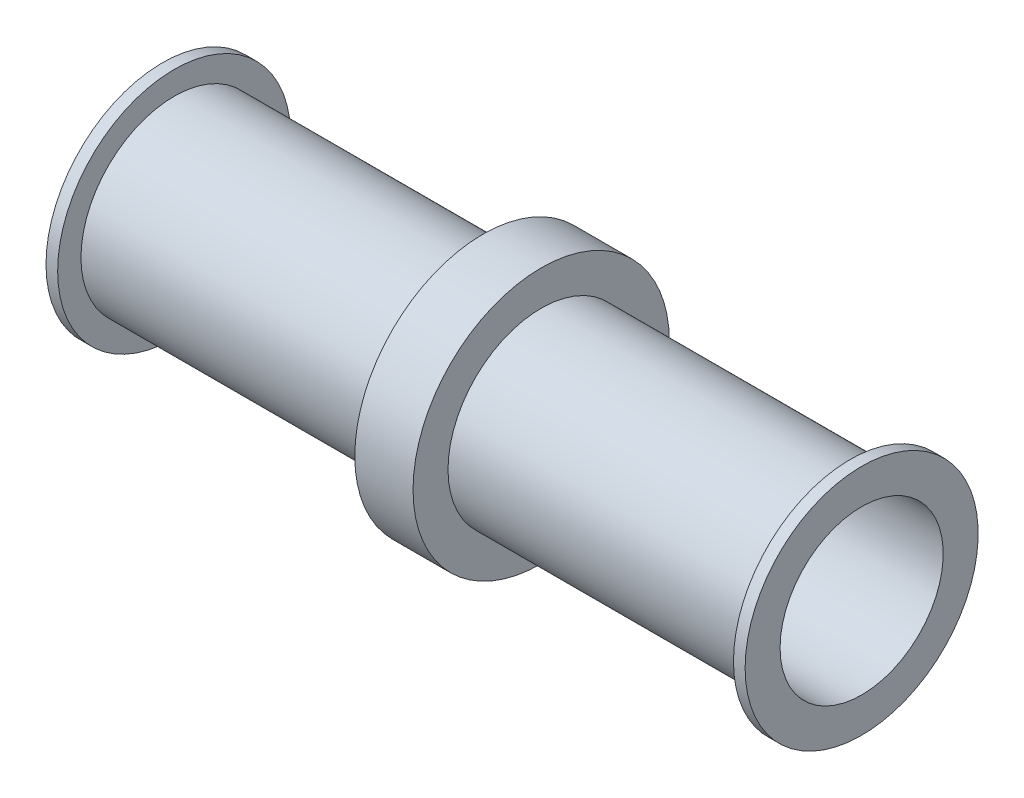
ISO-10303-21;
HEADER;
FILE_DESCRIPTION(('STEP AP214'),'2;1');
FILE_NAME('part.step','',(''),(''),'','','');
FILE_SCHEMA(('AUTOMOTIVE_DESIGN { 1 0 10303 214 1 1 1 1 }'));
ENDSEC;
DATA;
#1=APPLICATION_CONTEXT('core data for automotive mechanical design processes');
#2=APPLICATION_PROTOCOL_DEFINITION('international standard','automotive_design',2000,#1);
#3=PRODUCT_CONTEXT('',#1,'mechanical');
#4=PRODUCT('Part','Part','',(#3));
#5=PRODUCT_RELATED_PRODUCT_CATEGORY('part','',(#4));
#6=PRODUCT_DEFINITION_FORMATION('','',#4);
#7=PRODUCT_DEFINITION_CONTEXT('part definition',#1,'design');
#8=PRODUCT_DEFINITION('design','',#6,#7);
#9=PRODUCT_DEFINITION_SHAPE('','',#8);
#10=(LENGTH_UNIT() NAMED_UNIT(*) SI_UNIT(.MILLI.,.METRE.));
#11=(NAMED_UNIT(*) PLANE_ANGLE_UNIT() SI_UNIT($,.RADIAN.));
#12=(NAMED_UNIT(*) SI_UNIT($,.STERADIAN.) SOLID_ANGLE_UNIT());
#13=UNCERTAINTY_MEASURE_WITH_UNIT(LENGTH_MEASURE(1.E-05),#10,'distance_accuracy_value','');
#14=(GEOMETRIC_REPRESENTATION_CONTEXT(3) GLOBAL_UNCERTAINTY_ASSIGNED_CONTEXT((#13)) GLOBAL_UNIT_ASSIGNED_CONTEXT((#10,
#11,#12)) REPRESENTATION_CONTEXT('',''));
#15=CARTESIAN_POINT('',(0.,0.,0.));
#16=DIRECTION('',(0.,0.,1.));
#17=DIRECTION('',(1.,0.,0.));
#18=AXIS2_PLACEMENT_3D('',#15,#16,#17);
#19=CARTESIAN_POINT('',(0.,0.,0.));
#20=DIRECTION('',(-1.,0.,0.));
#21=DIRECTION('',(0.,0.,1.));
#22=AXIS2_PLACEMENT_3D('',#19,#20,#21);
#23=CYLINDRICAL_SURFACE('',#22,2.54);
#24=CARTESIAN_POINT('',(0.,0.,0.));
#25=DIRECTION('',(-1.,0.,0.));
#26=DIRECTION('',(0.,0.,1.));
#27=AXIS2_PLACEMENT_3D('',#24,#25,#26);
#28=CIRCLE('',#27,2.54);
#29=CARTESIAN_POINT('',(0.,0.,2.54));
#30=VERTEX_POINT('',#29);
#31=EDGE_CURVE('E72',#30,#30,#28,.T.);
#32=ORIENTED_EDGE('',*,*,#31,.F.);
#33=EDGE_LOOP('',(#32));
#34=FACE_BOUND('',#33,.T.);
#35=CARTESIAN_POINT('',(0.254,0.,0.));
#36=DIRECTION('',(-1.,0.,0.));
#37=DIRECTION('',(0.,0.,1.));
#38=AXIS2_PLACEMENT_3D('',#35,#36,#37);
#39=CIRCLE('',#38,2.54);
#40=CARTESIAN_POINT('',(0.254,0.,2.54));
#41=VERTEX_POINT('',#40);
#42=EDGE_CURVE('E10',#41,#41,#39,.T.);
#43=ORIENTED_EDGE('',*,*,#42,.T.);
#44=EDGE_LOOP('',(#43));
#45=FACE_BOUND('',#44,.T.);
#46=ADVANCED_FACE('F32',(#34,#45),#23,.T.);
#47=CARTESIAN_POINT('',(0.254,2.54,0.));
#48=DIRECTION('',(-1.,0.,0.));
#49=DIRECTION('',(0.,0.,1.));
#50=AXIS2_PLACEMENT_3D('',#47,#48,#49);
#51=PLANE('',#50);
#52=ORIENTED_EDGE('',*,*,#42,.F.);
#53=EDGE_LOOP('',(#52));
#54=FACE_BOUND('',#53,.T.);
#55=CARTESIAN_POINT('',(0.254,0.,0.));
#56=DIRECTION('',(-1.,0.,0.));
#57=DIRECTION('',(0.,0.,1.));
#58=AXIS2_PLACEMENT_3D('',#55,#56,#57);
#59=CIRCLE('',#58,2.032);
#60=CARTESIAN_POINT('',(0.254,0.,2.032));
#61=VERTEX_POINT('',#60);
#62=EDGE_CURVE('E38',#61,#61,#59,.T.);
#63=ORIENTED_EDGE('',*,*,#62,.T.);
#64=EDGE_LOOP('',(#63));
#65=FACE_BOUND('',#64,.T.);
#66=ADVANCED_FACE('F79',(#54,#65),#51,.F.);
#67=CARTESIAN_POINT('',(0.,0.,0.));
#68=DIRECTION('',(-1.,0.,0.));
#69=DIRECTION('',(0.,0.,1.));
#70=AXIS2_PLACEMENT_3D('',#67,#68,#69);
#71=CYLINDRICAL_SURFACE('',#70,2.032);
#72=ORIENTED_EDGE('',*,*,#62,.F.);
#73=EDGE_LOOP('',(#72));
#74=FACE_BOUND('',#73,.T.);
#75=CARTESIAN_POINT('',(6.985,0.,0.));
#76=DIRECTION('',(-1.,0.,0.));
#77=DIRECTION('',(0.,0.,1.));
#78=AXIS2_PLACEMENT_3D('',#75,#76,#77);
#79=CIRCLE('',#78,2.032);
#80=CARTESIAN_POINT('',(6.985,0.,2.032));
#81=VERTEX_POINT('',#80);
#82=EDGE_CURVE('E42',#81,#81,#79,.T.);
#83=ORIENTED_EDGE('',*,*,#82,.T.);
#84=EDGE_LOOP('',(#83));
#85=FACE_BOUND('',#84,.T.);
#86=ADVANCED_FACE('F83',(#74,#85),#71,.T.);
#87=CARTESIAN_POINT('',(6.985,2.794,0.));
#88=DIRECTION('',(1.,0.,0.));
#89=DIRECTION('',(0.,0.,-1.));
#90=AXIS2_PLACEMENT_3D('',#87,#88,#89);
#91=PLANE('',#90);
#92=ORIENTED_EDGE('',*,*,#82,.F.);
#93=EDGE_LOOP('',(#92));
#94=FACE_BOUND('',#93,.T.);
#95=CARTESIAN_POINT('',(6.985,0.,0.));
#96=DIRECTION('',(-1.,0.,0.));
#97=DIRECTION('',(0.,0.,1.));
#98=AXIS2_PLACEMENT_3D('',#95,#96,#97);
#99=CIRCLE('',#98,2.794);
#100=CARTESIAN_POINT('',(6.985,0.,2.794));
#101=VERTEX_POINT('',#100);
#102=EDGE_CURVE('E46',#101,#101,#99,.T.);
#103=ORIENTED_EDGE('',*,*,#102,.T.);
#104=EDGE_LOOP('',(#103));
#105=FACE_BOUND('',#104,.T.);
#106=ADVANCED_FACE('F88',(#94,#105),#91,.F.);
#107=CARTESIAN_POINT('',(0.,0.,0.));
#108=DIRECTION('',(-1.,0.,0.));
#109=DIRECTION('',(0.,0.,1.));
#110=AXIS2_PLACEMENT_3D('',#107,#108,#109);
#111=CYLINDRICAL_SURFACE('',#110,2.794);
#112=ORIENTED_EDGE('',*,*,#102,.F.);
#113=EDGE_LOOP('',(#112));
#114=FACE_BOUND('',#113,.T.);
#115=CARTESIAN_POINT('',(8.255,0.,0.));
#116=DIRECTION('',(-1.,0.,0.));
#117=DIRECTION('',(0.,0.,1.));
#118=AXIS2_PLACEMENT_3D('',#115,#116,#117);
#119=CIRCLE('',#118,2.794);
#120=CARTESIAN_POINT('',(8.255,0.,2.794));
#121=VERTEX_POINT('',#120);
#122=EDGE_CURVE('E51',#121,#121,#119,.T.);
#123=ORIENTED_EDGE('',*,*,#122,.T.);
#124=EDGE_LOOP('',(#123));
#125=FACE_BOUND('',#124,.T.);
#126=ADVANCED_FACE('F94',(#114,#125),#111,.T.);
#127=CARTESIAN_POINT('',(8.255,2.032,0.));
#128=DIRECTION('',(-1.,0.,0.));
#129=DIRECTION('',(0.,0.,1.));
#130=AXIS2_PLACEMENT_3D('',#127,#128,#129);
#131=PLANE('',#130);
#132=ORIENTED_EDGE('',*,*,#122,.F.);
#133=EDGE_LOOP('',(#132));
#134=FACE_BOUND('',#133,.T.);
#135=CARTESIAN_POINT('',(8.255,0.,0.));
#136=DIRECTION('',(-1.,0.,0.));
#137=DIRECTION('',(0.,0.,1.));
#138=AXIS2_PLACEMENT_3D('',#135,#136,#137);
#139=CIRCLE('',#138,2.032);
#140=CARTESIAN_POINT('',(8.255,0.,2.032));
#141=VERTEX_POINT('',#140);
#142=EDGE_CURVE('E54',#141,#141,#139,.T.);
#143=ORIENTED_EDGE('',*,*,#142,.T.);
#144=EDGE_LOOP('',(#143));
#145=FACE_BOUND('',#144,.T.);
#146=ADVANCED_FACE('F98',(#134,#145),#131,.F.);
#147=CARTESIAN_POINT('',(0.,0.,0.));
#148=DIRECTION('',(-1.,0.,0.));
#149=DIRECTION('',(0.,0.,1.));
#150=AXIS2_PLACEMENT_3D('',#147,#148,#149);
#151=CYLINDRICAL_SURFACE('',#150,2.032);
#152=ORIENTED_EDGE('',*,*,#142,.F.);
#153=EDGE_LOOP('',(#152));
#154=FACE_BOUND('',#153,.T.);
#155=CARTESIAN_POINT('',(14.986,0.,0.));
#156=DIRECTION('',(-1.,0.,0.));
#157=DIRECTION('',(0.,0.,1.));
#158=AXIS2_PLACEMENT_3D('',#155,#156,#157);
#159=CIRCLE('',#158,2.032);
#160=CARTESIAN_POINT('',(14.986,0.,2.032));
#161=VERTEX_POINT('',#160);
#162=EDGE_CURVE('E57',#161,#161,#159,.T.);
#163=ORIENTED_EDGE('',*,*,#162,.T.);
#164=EDGE_LOOP('',(#163));
#165=FACE_BOUND('',#164,.T.);
#166=ADVANCED_FACE('F102',(#154,#165),#151,.T.);
#167=CARTESIAN_POINT('',(14.986,2.032,0.));
#168=DIRECTION('',(1.,0.,0.));
#169=DIRECTION('',(0.,0.,-1.));
#170=AXIS2_PLACEMENT_3D('',#167,#168,#169);
#171=PLANE('',#170);
#172=ORIENTED_EDGE('',*,*,#162,.F.);
#173=EDGE_LOOP('',(#172));
#174=FACE_BOUND('',#173,.T.);
#175=CARTESIAN_POINT('',(14.986,0.,0.));
#176=DIRECTION('',(-1.,0.,0.));
#177=DIRECTION('',(0.,0.,1.));
#178=AXIS2_PLACEMENT_3D('',#175,#176,#177);
#179=CIRCLE('',#178,2.54);
#180=CARTESIAN_POINT('',(14.986,0.,2.54));
#181=VERTEX_POINT('',#180);
#182=EDGE_CURVE('E60',#181,#181,#179,.T.);
#183=ORIENTED_EDGE('',*,*,#182,.T.);
#184=EDGE_LOOP('',(#183));
#185=FACE_BOUND('',#184,.T.);
#186=ADVANCED_FACE('F106',(#174,#185),#171,.F.);
#187=CARTESIAN_POINT('',(0.,0.,0.));
#188=DIRECTION('',(-1.,0.,0.));
#189=DIRECTION('',(0.,0.,1.));
#190=AXIS2_PLACEMENT_3D('',#187,#188,#189);
#191=CYLINDRICAL_SURFACE('',#190,2.54);
#192=ORIENTED_EDGE('',*,*,#182,.F.);
#193=EDGE_LOOP('',(#192));
#194=FACE_BOUND('',#193,.T.);
#195=CARTESIAN_POINT('',(15.24,0.,0.));
#196=DIRECTION('',(-1.,0.,0.));
#197=DIRECTION('',(0.,0.,1.));
#198=AXIS2_PLACEMENT_3D('',#195,#196,#197);
#199=CIRCLE('',#198,2.54);
#200=CARTESIAN_POINT('',(15.24,0.,2.54));
#201=VERTEX_POINT('',#200);
#202=EDGE_CURVE('E63',#201,#201,#199,.T.);
#203=ORIENTED_EDGE('',*,*,#202,.T.);
#204=EDGE_LOOP('',(#203));
#205=FACE_BOUND('',#204,.T.);
#206=ADVANCED_FACE('F110',(#194,#205),#191,.T.);
#207=CARTESIAN_POINT('',(15.24,2.54,0.));
#208=DIRECTION('',(-1.,0.,0.));
#209=DIRECTION('',(0.,0.,1.));
#210=AXIS2_PLACEMENT_3D('',#207,#208,#209);
#211=PLANE('',#210);
#212=ORIENTED_EDGE('',*,*,#202,.F.);
#213=EDGE_LOOP('',(#212));
#214=FACE_BOUND('',#213,.T.);
#215=CARTESIAN_POINT('',(15.24,0.,0.));
#216=DIRECTION('',(-1.,0.,0.));
#217=DIRECTION('',(0.,0.,1.));
#218=AXIS2_PLACEMENT_3D('',#215,#216,#217);
#219=CIRCLE('',#218,1.778);
#220=CARTESIAN_POINT('',(15.24,0.,1.778));
#221=VERTEX_POINT('',#220);
#222=EDGE_CURVE('E66',#221,#221,#219,.T.);
#223=ORIENTED_EDGE('',*,*,#222,.T.);
#224=EDGE_LOOP('',(#223));
#225=FACE_BOUND('',#224,.T.);
#226=ADVANCED_FACE('F114',(#214,#225),#211,.F.);
#227=CARTESIAN_POINT('',(0.,0.,0.));
#228=DIRECTION('',(-1.,0.,0.));
#229=DIRECTION('',(0.,0.,1.));
#230=AXIS2_PLACEMENT_3D('',#227,#228,#229);
#231=CYLINDRICAL_SURFACE('',#230,1.778);
#232=ORIENTED_EDGE('',*,*,#222,.F.);
#233=EDGE_LOOP('',(#232));
#234=FACE_BOUND('',#233,.T.);
#235=CARTESIAN_POINT('',(0.,0.,0.));
#236=DIRECTION('',(-1.,0.,0.));
#237=DIRECTION('',(0.,0.,1.));
#238=AXIS2_PLACEMENT_3D('',#235,#236,#237);
#239=CIRCLE('',#238,1.778);
#240=CARTESIAN_POINT('',(0.,0.,1.778));
#241=VERTEX_POINT('',#240);
#242=EDGE_CURVE('E69',#241,#241,#239,.T.);
#243=ORIENTED_EDGE('',*,*,#242,.T.);
#244=EDGE_LOOP('',(#243));
#245=FACE_BOUND('',#244,.T.);
#246=ADVANCED_FACE('F118',(#234,#245),#231,.F.);
#247=CARTESIAN_POINT('',(0.,1.778,0.));
#248=DIRECTION('',(1.,0.,0.));
#249=DIRECTION('',(0.,0.,-1.));
#250=AXIS2_PLACEMENT_3D('',#247,#248,#249);
#251=PLANE('',#250);
#252=ORIENTED_EDGE('',*,*,#242,.F.);
#253=EDGE_LOOP('',(#252));
#254=FACE_BOUND('',#253,.T.);
#255=ORIENTED_EDGE('',*,*,#31,.T.);
#256=EDGE_LOOP('',(#255));
#257=FACE_BOUND('',#256,.T.);
#258=ADVANCED_FACE('F76',(#254,#257),#251,.F.);
#259=CLOSED_SHELL('',(#46,#66,#86,#106,#126,#146,#166,#186,#206,#226,#246,#258));
#260=MANIFOLD_SOLID_BREP('B2',#259);
#261=ADVANCED_BREP_SHAPE_REPRESENTATION('',(#18,#260),#14);
#262=SHAPE_DEFINITION_REPRESENTATION(#9,#261);
ENDSEC;
END-ISO-10303-21;
